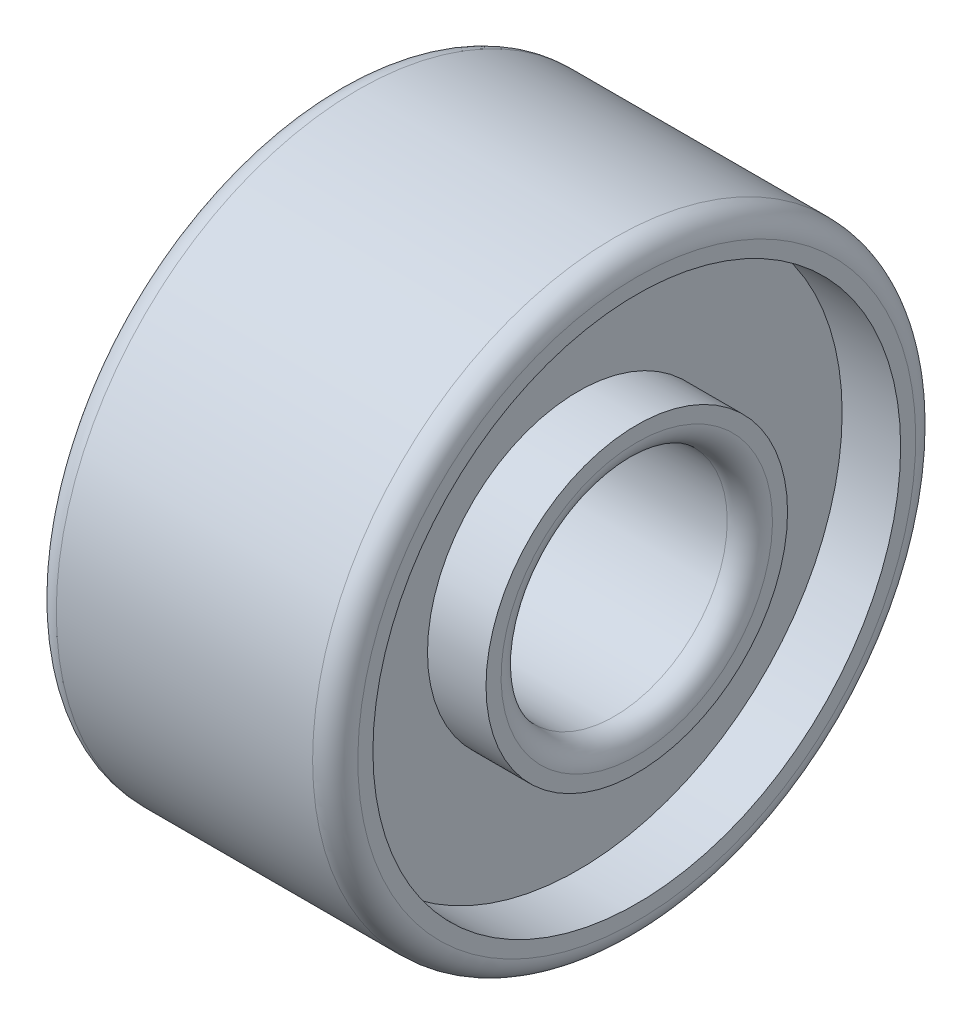
ISO-10303-21;
HEADER;
FILE_DESCRIPTION(('STEP AP214'),'2;1');
FILE_NAME('part.step','',(''),(''),'','','');
FILE_SCHEMA(('AUTOMOTIVE_DESIGN { 1 0 10303 214 1 1 1 1 }'));
ENDSEC;
DATA;
#1=APPLICATION_CONTEXT('core data for automotive mechanical design processes');
#2=APPLICATION_PROTOCOL_DEFINITION('international standard','automotive_design',2000,#1);
#3=PRODUCT_CONTEXT('',#1,'mechanical');
#4=PRODUCT('Part','Part','',(#3));
#5=PRODUCT_RELATED_PRODUCT_CATEGORY('part','',(#4));
#6=PRODUCT_DEFINITION_FORMATION('','',#4);
#7=PRODUCT_DEFINITION_CONTEXT('part definition',#1,'design');
#8=PRODUCT_DEFINITION('design','',#6,#7);
#9=PRODUCT_DEFINITION_SHAPE('','',#8);
#10=(LENGTH_UNIT() NAMED_UNIT(*) SI_UNIT(.MILLI.,.METRE.));
#11=(NAMED_UNIT(*) PLANE_ANGLE_UNIT() SI_UNIT($,.RADIAN.));
#12=(NAMED_UNIT(*) SI_UNIT($,.STERADIAN.) SOLID_ANGLE_UNIT());
#13=UNCERTAINTY_MEASURE_WITH_UNIT(LENGTH_MEASURE(1.E-05),#10,'distance_accuracy_value','');
#14=(GEOMETRIC_REPRESENTATION_CONTEXT(3) GLOBAL_UNCERTAINTY_ASSIGNED_CONTEXT((#13)) GLOBAL_UNIT_ASSIGNED_CONTEXT((#10,
#11,#12)) REPRESENTATION_CONTEXT('',''));
#15=CARTESIAN_POINT('',(0.,0.,0.));
#16=DIRECTION('',(0.,0.,1.));
#17=DIRECTION('',(1.,0.,0.));
#18=AXIS2_PLACEMENT_3D('',#15,#16,#17);
#19=CARTESIAN_POINT('',(0.,1.94454364826301,1.94454364826301));
#20=DIRECTION('',(1.,0.,0.));
#21=DIRECTION('',(0.,-0.707106781186548,0.707106781186548));
#22=AXIS2_PLACEMENT_3D('',#19,#20,#21);
#23=SPHERICAL_SURFACE('',#22,0.75);
#24=CARTESIAN_POINT('',(-0.749999999999993,1.94454364826301,1.94454364826301));
#25=VERTEX_POINT('',#24);
#26=VERTEX_LOOP('',#25);
#27=FACE_BOUND('',#26,.T.);
#28=CARTESIAN_POINT('',(0.750000000000007,1.94454364826301,1.94454364826301));
#29=VERTEX_POINT('',#28);
#30=VERTEX_LOOP('',#29);
#31=FACE_BOUND('',#30,.T.);
#32=ADVANCED_FACE('P0_F15',(#27,#31),#23,.T.);
#33=CLOSED_SHELL('',(#32));
#34=MANIFOLD_SOLID_BREP('P0_B1',#33);
#35=CARTESIAN_POINT('',(0.,0.,2.75));
#36=DIRECTION('',(1.,0.,0.));
#37=DIRECTION('',(0.,-1.,0.));
#38=AXIS2_PLACEMENT_3D('',#35,#36,#37);
#39=SPHERICAL_SURFACE('',#38,0.75);
#40=CARTESIAN_POINT('',(-0.749999999999993,0.,2.75));
#41=VERTEX_POINT('',#40);
#42=VERTEX_LOOP('',#41);
#43=FACE_BOUND('',#42,.T.);
#44=CARTESIAN_POINT('',(0.750000000000007,0.,2.75));
#45=VERTEX_POINT('',#44);
#46=VERTEX_LOOP('',#45);
#47=FACE_BOUND('',#46,.T.);
#48=ADVANCED_FACE('P1_F16',(#43,#47),#39,.T.);
#49=CLOSED_SHELL('',(#48));
#50=MANIFOLD_SOLID_BREP('P1_B1',#49);
#51=CARTESIAN_POINT('',(0.,-1.94454364826301,1.94454364826301));
#52=DIRECTION('',(1.,0.,0.));
#53=DIRECTION('',(0.,-0.707106781186548,-0.707106781186548));
#54=AXIS2_PLACEMENT_3D('',#51,#52,#53);
#55=SPHERICAL_SURFACE('',#54,0.75);
#56=CARTESIAN_POINT('',(-0.749999999999993,-1.94454364826301,1.94454364826301));
#57=VERTEX_POINT('',#56);
#58=VERTEX_LOOP('',#57);
#59=FACE_BOUND('',#58,.T.);
#60=CARTESIAN_POINT('',(0.750000000000007,-1.94454364826301,1.94454364826301));
#61=VERTEX_POINT('',#60);
#62=VERTEX_LOOP('',#61);
#63=FACE_BOUND('',#62,.T.);
#64=ADVANCED_FACE('P2_F16',(#59,#63),#55,.T.);
#65=CLOSED_SHELL('',(#64));
#66=MANIFOLD_SOLID_BREP('P2_B1',#65);
#67=CARTESIAN_POINT('',(0.,-2.75,0.));
#68=DIRECTION('',(1.,0.,0.));
#69=DIRECTION('',(0.,0.,-1.));
#70=AXIS2_PLACEMENT_3D('',#67,#68,#69);
#71=SPHERICAL_SURFACE('',#70,0.75);
#72=CARTESIAN_POINT('',(-0.749999999999993,-2.75,0.));
#73=VERTEX_POINT('',#72);
#74=VERTEX_LOOP('',#73);
#75=FACE_BOUND('',#74,.T.);
#76=CARTESIAN_POINT('',(0.750000000000007,-2.75,0.));
#77=VERTEX_POINT('',#76);
#78=VERTEX_LOOP('',#77);
#79=FACE_BOUND('',#78,.T.);
#80=ADVANCED_FACE('P3_F16',(#75,#79),#71,.T.);
#81=CLOSED_SHELL('',(#80));
#82=MANIFOLD_SOLID_BREP('P3_B1',#81);
#83=CARTESIAN_POINT('',(0.,-1.94454364826301,-1.94454364826301));
#84=DIRECTION('',(1.,0.,0.));
#85=DIRECTION('',(0.,0.707106781186548,-0.707106781186548));
#86=AXIS2_PLACEMENT_3D('',#83,#84,#85);
#87=SPHERICAL_SURFACE('',#86,0.75);
#88=CARTESIAN_POINT('',(-0.749999999999993,-1.94454364826301,-1.94454364826301));
#89=VERTEX_POINT('',#88);
#90=VERTEX_LOOP('',#89);
#91=FACE_BOUND('',#90,.T.);
#92=CARTESIAN_POINT('',(0.750000000000007,-1.94454364826301,-1.94454364826301));
#93=VERTEX_POINT('',#92);
#94=VERTEX_LOOP('',#93);
#95=FACE_BOUND('',#94,.T.);
#96=ADVANCED_FACE('P4_F16',(#91,#95),#87,.T.);
#97=CLOSED_SHELL('',(#96));
#98=MANIFOLD_SOLID_BREP('P4_B1',#97);
#99=CARTESIAN_POINT('',(0.,0.,-2.75));
#100=DIRECTION('',(1.,0.,0.));
#101=DIRECTION('',(0.,1.,0.));
#102=AXIS2_PLACEMENT_3D('',#99,#100,#101);
#103=SPHERICAL_SURFACE('',#102,0.75);
#104=CARTESIAN_POINT('',(-0.749999999999993,0.,-2.75));
#105=VERTEX_POINT('',#104);
#106=VERTEX_LOOP('',#105);
#107=FACE_BOUND('',#106,.T.);
#108=CARTESIAN_POINT('',(0.750000000000007,0.,-2.75));
#109=VERTEX_POINT('',#108);
#110=VERTEX_LOOP('',#109);
#111=FACE_BOUND('',#110,.T.);
#112=ADVANCED_FACE('P5_F16',(#107,#111),#103,.T.);
#113=CLOSED_SHELL('',(#112));
#114=MANIFOLD_SOLID_BREP('P5_B1',#113);
#115=CARTESIAN_POINT('',(0.,1.94454364826301,-1.94454364826301));
#116=DIRECTION('',(1.,0.,0.));
#117=DIRECTION('',(0.,0.707106781186548,0.707106781186548));
#118=AXIS2_PLACEMENT_3D('',#115,#116,#117);
#119=SPHERICAL_SURFACE('',#118,0.75);
#120=CARTESIAN_POINT('',(-0.749999999999993,1.94454364826301,-1.94454364826301));
#121=VERTEX_POINT('',#120);
#122=VERTEX_LOOP('',#121);
#123=FACE_BOUND('',#122,.T.);
#124=CARTESIAN_POINT('',(0.750000000000007,1.94454364826301,-1.94454364826301));
#125=VERTEX_POINT('',#124);
#126=VERTEX_LOOP('',#125);
#127=FACE_BOUND('',#126,.T.);
#128=ADVANCED_FACE('P6_F16',(#123,#127),#119,.T.);
#129=CLOSED_SHELL('',(#128));
#130=MANIFOLD_SOLID_BREP('P6_B1',#129);
#131=CARTESIAN_POINT('',(-1.07407407407407,0.,0.));
#132=DIRECTION('',(1.,0.,0.));
#133=DIRECTION('',(0.,0.,-1.));
#134=AXIS2_PLACEMENT_3D('',#131,#132,#133);
#135=PLANE('',#134);
#136=CARTESIAN_POINT('',(-1.07407407407407,0.,0.));
#137=DIRECTION('',(-1.,0.,0.));
#138=DIRECTION('',(0.,0.,1.));
#139=AXIS2_PLACEMENT_3D('',#136,#137,#138);
#140=CIRCLE('',#139,2.);
#141=CARTESIAN_POINT('',(-1.07407407407407,0.,2.));
#142=VERTEX_POINT('',#141);
#143=EDGE_CURVE('P7_E27',#142,#142,#140,.T.);
#144=ORIENTED_EDGE('',*,*,#143,.T.);
#145=EDGE_LOOP('',(#144));
#146=FACE_BOUND('',#145,.T.);
#147=CARTESIAN_POINT('',(-1.07407407407407,0.,0.));
#148=DIRECTION('',(-1.,0.,0.));
#149=DIRECTION('',(0.,0.,1.));
#150=AXIS2_PLACEMENT_3D('',#147,#148,#149);
#151=CIRCLE('',#150,3.65);
#152=CARTESIAN_POINT('',(-1.07407407407407,0.,3.65));
#153=VERTEX_POINT('',#152);
#154=EDGE_CURVE('P7_E18',#153,#153,#151,.T.);
#155=ORIENTED_EDGE('',*,*,#154,.F.);
#156=EDGE_LOOP('',(#155));
#157=FACE_BOUND('',#156,.T.);
#158=ADVANCED_FACE('P7_F15',(#146,#157),#135,.T.);
#159=CARTESIAN_POINT('',(-1.07407407407407,0.,0.));
#160=DIRECTION('',(-1.,0.,0.));
#161=DIRECTION('',(0.,0.,1.));
#162=AXIS2_PLACEMENT_3D('',#159,#160,#161);
#163=CYLINDRICAL_SURFACE('',#162,3.65);
#164=ORIENTED_EDGE('',*,*,#154,.T.);
#165=EDGE_LOOP('',(#164));
#166=FACE_BOUND('',#165,.T.);
#167=CARTESIAN_POINT('',(-1.22407407407408,0.,0.));
#168=DIRECTION('',(-1.,0.,0.));
#169=DIRECTION('',(0.,0.,1.));
#170=AXIS2_PLACEMENT_3D('',#167,#168,#169);
#171=CIRCLE('',#170,3.65);
#172=CARTESIAN_POINT('',(-1.22407407407408,0.,3.65));
#173=VERTEX_POINT('',#172);
#174=EDGE_CURVE('P7_E22',#173,#173,#171,.T.);
#175=ORIENTED_EDGE('',*,*,#174,.F.);
#176=EDGE_LOOP('',(#175));
#177=FACE_BOUND('',#176,.T.);
#178=ADVANCED_FACE('P7_F35',(#166,#177),#163,.T.);
#179=CARTESIAN_POINT('',(-1.22407407407408,0.,0.));
#180=DIRECTION('',(-1.,0.,0.));
#181=DIRECTION('',(0.,0.,1.));
#182=AXIS2_PLACEMENT_3D('',#179,#180,#181);
#183=CYLINDRICAL_SURFACE('',#182,2.);
#184=ORIENTED_EDGE('',*,*,#143,.F.);
#185=EDGE_LOOP('',(#184));
#186=FACE_BOUND('',#185,.T.);
#187=CARTESIAN_POINT('',(-1.22407407407408,0.,0.));
#188=DIRECTION('',(-1.,0.,0.));
#189=DIRECTION('',(0.,0.,1.));
#190=AXIS2_PLACEMENT_3D('',#187,#188,#189);
#191=CIRCLE('',#190,2.);
#192=CARTESIAN_POINT('',(-1.22407407407408,0.,2.));
#193=VERTEX_POINT('',#192);
#194=EDGE_CURVE('P7_E10',#193,#193,#191,.F.);
#195=ORIENTED_EDGE('',*,*,#194,.F.);
#196=EDGE_LOOP('',(#195));
#197=FACE_BOUND('',#196,.T.);
#198=ADVANCED_FACE('P7_F43',(#186,#197),#183,.F.);
#199=CARTESIAN_POINT('',(-1.22407407407408,0.,0.));
#200=DIRECTION('',(-1.,0.,0.));
#201=DIRECTION('',(0.,0.,1.));
#202=AXIS2_PLACEMENT_3D('',#199,#200,#201);
#203=PLANE('',#202);
#204=ORIENTED_EDGE('',*,*,#194,.T.);
#205=EDGE_LOOP('',(#204));
#206=FACE_BOUND('',#205,.T.);
#207=ORIENTED_EDGE('',*,*,#174,.T.);
#208=EDGE_LOOP('',(#207));
#209=FACE_BOUND('',#208,.T.);
#210=ADVANCED_FACE('P7_F44',(#206,#209),#203,.T.);
#211=CLOSED_SHELL('',(#158,#178,#198,#210));
#212=MANIFOLD_SOLID_BREP('P7_B1',#211);
#213=CARTESIAN_POINT('',(1.07407407407407,0.,0.));
#214=DIRECTION('',(-1.,0.,0.));
#215=DIRECTION('',(0.,0.,1.));
#216=AXIS2_PLACEMENT_3D('',#213,#214,#215);
#217=PLANE('',#216);
#218=CARTESIAN_POINT('',(1.07407407407407,0.,0.));
#219=DIRECTION('',(1.,0.,0.));
#220=DIRECTION('',(0.,0.,-1.));
#221=AXIS2_PLACEMENT_3D('',#218,#219,#220);
#222=CIRCLE('',#221,2.);
#223=CARTESIAN_POINT('',(1.07407407407407,0.,-2.));
#224=VERTEX_POINT('',#223);
#225=EDGE_CURVE('P8_E27',#224,#224,#222,.T.);
#226=ORIENTED_EDGE('',*,*,#225,.T.);
#227=EDGE_LOOP('',(#226));
#228=FACE_BOUND('',#227,.T.);
#229=CARTESIAN_POINT('',(1.07407407407407,0.,0.));
#230=DIRECTION('',(1.,0.,0.));
#231=DIRECTION('',(0.,0.,-1.));
#232=AXIS2_PLACEMENT_3D('',#229,#230,#231);
#233=CIRCLE('',#232,3.65);
#234=CARTESIAN_POINT('',(1.07407407407407,0.,-3.65));
#235=VERTEX_POINT('',#234);
#236=EDGE_CURVE('P8_E18',#235,#235,#233,.T.);
#237=ORIENTED_EDGE('',*,*,#236,.F.);
#238=EDGE_LOOP('',(#237));
#239=FACE_BOUND('',#238,.T.);
#240=ADVANCED_FACE('P8_F15',(#228,#239),#217,.T.);
#241=CARTESIAN_POINT('',(1.07407407407407,0.,0.));
#242=DIRECTION('',(1.,0.,0.));
#243=DIRECTION('',(0.,0.,-1.));
#244=AXIS2_PLACEMENT_3D('',#241,#242,#243);
#245=CYLINDRICAL_SURFACE('',#244,3.65);
#246=ORIENTED_EDGE('',*,*,#236,.T.);
#247=EDGE_LOOP('',(#246));
#248=FACE_BOUND('',#247,.T.);
#249=CARTESIAN_POINT('',(1.22407407407408,0.,0.));
#250=DIRECTION('',(1.,0.,0.));
#251=DIRECTION('',(0.,0.,-1.));
#252=AXIS2_PLACEMENT_3D('',#249,#250,#251);
#253=CIRCLE('',#252,3.65);
#254=CARTESIAN_POINT('',(1.22407407407408,0.,-3.65));
#255=VERTEX_POINT('',#254);
#256=EDGE_CURVE('P8_E22',#255,#255,#253,.T.);
#257=ORIENTED_EDGE('',*,*,#256,.F.);
#258=EDGE_LOOP('',(#257));
#259=FACE_BOUND('',#258,.T.);
#260=ADVANCED_FACE('P8_F35',(#248,#259),#245,.T.);
#261=CARTESIAN_POINT('',(1.22407407407408,0.,0.));
#262=DIRECTION('',(1.,0.,0.));
#263=DIRECTION('',(0.,0.,-1.));
#264=AXIS2_PLACEMENT_3D('',#261,#262,#263);
#265=CYLINDRICAL_SURFACE('',#264,2.);
#266=ORIENTED_EDGE('',*,*,#225,.F.);
#267=EDGE_LOOP('',(#266));
#268=FACE_BOUND('',#267,.T.);
#269=CARTESIAN_POINT('',(1.22407407407408,0.,0.));
#270=DIRECTION('',(1.,0.,0.));
#271=DIRECTION('',(0.,0.,-1.));
#272=AXIS2_PLACEMENT_3D('',#269,#270,#271);
#273=CIRCLE('',#272,2.);
#274=CARTESIAN_POINT('',(1.22407407407408,0.,-2.));
#275=VERTEX_POINT('',#274);
#276=EDGE_CURVE('P8_E10',#275,#275,#273,.F.);
#277=ORIENTED_EDGE('',*,*,#276,.F.);
#278=EDGE_LOOP('',(#277));
#279=FACE_BOUND('',#278,.T.);
#280=ADVANCED_FACE('P8_F43',(#268,#279),#265,.F.);
#281=CARTESIAN_POINT('',(1.22407407407408,0.,0.));
#282=DIRECTION('',(1.,0.,0.));
#283=DIRECTION('',(0.,0.,-1.));
#284=AXIS2_PLACEMENT_3D('',#281,#282,#283);
#285=PLANE('',#284);
#286=ORIENTED_EDGE('',*,*,#276,.T.);
#287=EDGE_LOOP('',(#286));
#288=FACE_BOUND('',#287,.T.);
#289=ORIENTED_EDGE('',*,*,#256,.T.);
#290=EDGE_LOOP('',(#289));
#291=FACE_BOUND('',#290,.T.);
#292=ADVANCED_FACE('P8_F44',(#288,#291),#285,.T.);
#293=CLOSED_SHELL('',(#240,#260,#280,#292));
#294=MANIFOLD_SOLID_BREP('P8_B1',#293);
#295=CARTESIAN_POINT('',(0.,2.75,0.));
#296=DIRECTION('',(1.,0.,0.));
#297=DIRECTION('',(0.,0.,1.));
#298=AXIS2_PLACEMENT_3D('',#295,#296,#297);
#299=SPHERICAL_SURFACE('',#298,0.75);
#300=CARTESIAN_POINT('',(-0.749999999999993,2.75,0.));
#301=VERTEX_POINT('',#300);
#302=VERTEX_LOOP('',#301);
#303=FACE_BOUND('',#302,.T.);
#304=CARTESIAN_POINT('',(0.750000000000007,2.75,0.));
#305=VERTEX_POINT('',#304);
#306=VERTEX_LOOP('',#305);
#307=FACE_BOUND('',#306,.T.);
#308=ADVANCED_FACE('P9_F16',(#303,#307),#299,.T.);
#309=CLOSED_SHELL('',(#308));
#310=MANIFOLD_SOLID_BREP('P9_B1',#309);
#311=CARTESIAN_POINT('',(0.,0.,0.));
#312=DIRECTION('',(1.,0.,0.));
#313=DIRECTION('',(0.,1.,0.));
#314=AXIS2_PLACEMENT_3D('',#311,#312,#313);
#315=TOROIDAL_SURFACE('',#314,2.75,0.75);
#316=CARTESIAN_POINT('',(-0.481534007106452,0.,0.));
#317=DIRECTION('',(1.,0.,0.));
#318=DIRECTION('',(0.,0.,-1.));
#319=AXIS2_PLACEMENT_3D('',#316,#317,#318);
#320=CIRCLE('',#319,3.325);
#321=CARTESIAN_POINT('',(-0.481534007106452,0.,-3.325));
#322=VERTEX_POINT('',#321);
#323=EDGE_CURVE('P10_E169',#322,#322,#320,.F.);
#324=ORIENTED_EDGE('',*,*,#323,.T.);
#325=EDGE_LOOP('',(#324));
#326=FACE_BOUND('',#325,.T.);
#327=CARTESIAN_POINT('',(0.481534007106451,0.,0.));
#328=DIRECTION('',(1.,0.,0.));
#329=DIRECTION('',(0.,0.,-1.));
#330=AXIS2_PLACEMENT_3D('',#327,#328,#329);
#331=CIRCLE('',#330,3.325);
#332=CARTESIAN_POINT('',(0.481534007106451,0.,-3.325));
#333=VERTEX_POINT('',#332);
#334=EDGE_CURVE('P10_E172',#333,#333,#331,.T.);
#335=ORIENTED_EDGE('',*,*,#334,.T.);
#336=EDGE_LOOP('',(#335));
#337=FACE_BOUND('',#336,.T.);
#338=ADVANCED_FACE('P10_F15',(#326,#337),#315,.F.);
#339=CARTESIAN_POINT('',(2.00000000000003,0.,0.));
#340=DIRECTION('',(1.,0.,0.));
#341=DIRECTION('',(0.,0.,-1.));
#342=AXIS2_PLACEMENT_3D('',#339,#340,#341);
#343=CYLINDRICAL_SURFACE('',#342,3.325);
#344=ORIENTED_EDGE('',*,*,#334,.F.);
#345=EDGE_LOOP('',(#344));
#346=FACE_BOUND('',#345,.T.);
#347=CARTESIAN_POINT('',(1.07407407407408,0.,0.));
#348=DIRECTION('',(1.,0.,0.));
#349=DIRECTION('',(0.,0.,-1.));
#350=AXIS2_PLACEMENT_3D('',#347,#348,#349);
#351=CIRCLE('',#350,3.325);
#352=CARTESIAN_POINT('',(1.07407407407408,0.,-3.325));
#353=VERTEX_POINT('',#352);
#354=EDGE_CURVE('P10_E19',#353,#353,#351,.T.);
#355=ORIENTED_EDGE('',*,*,#354,.T.);
#356=EDGE_LOOP('',(#355));
#357=FACE_BOUND('',#356,.T.);
#358=ADVANCED_FACE('P10_F118',(#346,#357),#343,.F.);
#359=CARTESIAN_POINT('',(2.00000000000003,0.,0.));
#360=DIRECTION('',(1.,0.,0.));
#361=DIRECTION('',(0.,0.,-1.));
#362=AXIS2_PLACEMENT_3D('',#359,#360,#361);
#363=CYLINDRICAL_SURFACE('',#362,3.325);
#364=CARTESIAN_POINT('',(-1.07407407407407,0.,0.));
#365=DIRECTION('',(1.,0.,0.));
#366=DIRECTION('',(0.,0.,-1.));
#367=AXIS2_PLACEMENT_3D('',#364,#365,#366);
#368=CIRCLE('',#367,3.325);
#369=CARTESIAN_POINT('',(-1.07407407407407,0.,-3.325));
#370=VERTEX_POINT('',#369);
#371=EDGE_CURVE('P10_E165',#370,#370,#368,.F.);
#372=ORIENTED_EDGE('',*,*,#371,.T.);
#373=EDGE_LOOP('',(#372));
#374=FACE_BOUND('',#373,.T.);
#375=ORIENTED_EDGE('',*,*,#323,.F.);
#376=EDGE_LOOP('',(#375));
#377=FACE_BOUND('',#376,.T.);
#378=ADVANCED_FACE('P10_F115',(#374,#377),#363,.F.);
#379=CARTESIAN_POINT('',(1.07407407407408,0.,0.));
#380=DIRECTION('',(-1.,0.,0.));
#381=DIRECTION('',(0.,0.,1.));
#382=AXIS2_PLACEMENT_3D('',#379,#380,#381);
#383=PLANE('',#382);
#384=ORIENTED_EDGE('',*,*,#354,.F.);
#385=EDGE_LOOP('',(#384));
#386=FACE_BOUND('',#385,.T.);
#387=CARTESIAN_POINT('',(1.07407407407408,0.,0.));
#388=DIRECTION('',(1.,0.,0.));
#389=DIRECTION('',(0.,0.,-1.));
#390=AXIS2_PLACEMENT_3D('',#387,#388,#389);
#391=CIRCLE('',#390,3.64999999999999);
#392=CARTESIAN_POINT('',(1.07407407407408,0.,-3.64999999999999));
#393=VERTEX_POINT('',#392);
#394=EDGE_CURVE('P10_E163',#393,#393,#391,.T.);
#395=ORIENTED_EDGE('',*,*,#394,.T.);
#396=EDGE_LOOP('',(#395));
#397=FACE_BOUND('',#396,.T.);
#398=ADVANCED_FACE('P10_F111',(#386,#397),#383,.F.);
#399=CARTESIAN_POINT('',(-1.07407407407407,0.,0.));
#400=DIRECTION('',(1.,0.,0.));
#401=DIRECTION('',(0.,0.,-1.));
#402=AXIS2_PLACEMENT_3D('',#399,#400,#401);
#403=PLANE('',#402);
#404=ORIENTED_EDGE('',*,*,#371,.F.);
#405=EDGE_LOOP('',(#404));
#406=FACE_BOUND('',#405,.T.);
#407=CARTESIAN_POINT('',(-1.07407407407406,0.,0.));
#408=DIRECTION('',(1.,0.,0.));
#409=DIRECTION('',(0.,0.,-1.));
#410=AXIS2_PLACEMENT_3D('',#407,#408,#409);
#411=CIRCLE('',#410,3.64999999999998);
#412=CARTESIAN_POINT('',(-1.07407407407406,0.,-3.64999999999998));
#413=VERTEX_POINT('',#412);
#414=EDGE_CURVE('P10_E160',#413,#413,#411,.F.);
#415=ORIENTED_EDGE('',*,*,#414,.T.);
#416=EDGE_LOOP('',(#415));
#417=FACE_BOUND('',#416,.T.);
#418=ADVANCED_FACE('P10_F107',(#406,#417),#403,.F.);
#419=CARTESIAN_POINT('',(1.07407407407408,0.,0.));
#420=DIRECTION('',(1.,0.,0.));
#421=DIRECTION('',(0.,0.,-1.));
#422=AXIS2_PLACEMENT_3D('',#419,#420,#421);
#423=CYLINDRICAL_SURFACE('',#422,3.64999999999999);
#424=ORIENTED_EDGE('',*,*,#394,.F.);
#425=EDGE_LOOP('',(#424));
#426=FACE_BOUND('',#425,.T.);
#427=CARTESIAN_POINT('',(1.22407407407407,0.,0.));
#428=DIRECTION('',(1.,0.,0.));
#429=DIRECTION('',(0.,0.,-1.));
#430=AXIS2_PLACEMENT_3D('',#427,#428,#429);
#431=CIRCLE('',#430,3.64999999999999);
#432=CARTESIAN_POINT('',(1.22407407407407,0.,-3.64999999999999));
#433=VERTEX_POINT('',#432);
#434=EDGE_CURVE('P10_E157',#433,#433,#431,.T.);
#435=ORIENTED_EDGE('',*,*,#434,.T.);
#436=EDGE_LOOP('',(#435));
#437=FACE_BOUND('',#436,.T.);
#438=ADVANCED_FACE('P10_F103',(#426,#437),#423,.F.);
#439=CARTESIAN_POINT('',(-1.22407407407407,0.,0.));
#440=DIRECTION('',(1.,0.,0.));
#441=DIRECTION('',(0.,0.,-1.));
#442=AXIS2_PLACEMENT_3D('',#439,#440,#441);
#443=CYLINDRICAL_SURFACE('',#442,3.64999999999998);
#444=CARTESIAN_POINT('',(-1.22407407407407,0.,0.));
#445=DIRECTION('',(1.,0.,0.));
#446=DIRECTION('',(0.,0.,-1.));
#447=AXIS2_PLACEMENT_3D('',#444,#445,#446);
#448=CIRCLE('',#447,3.64999999999998);
#449=CARTESIAN_POINT('',(-1.22407407407407,0.,-3.64999999999998));
#450=VERTEX_POINT('',#449);
#451=EDGE_CURVE('P10_E154',#450,#450,#448,.F.);
#452=ORIENTED_EDGE('',*,*,#451,.T.);
#453=EDGE_LOOP('',(#452));
#454=FACE_BOUND('',#453,.T.);
#455=ORIENTED_EDGE('',*,*,#414,.F.);
#456=EDGE_LOOP('',(#455));
#457=FACE_BOUND('',#456,.T.);
#458=ADVANCED_FACE('P10_F99',(#454,#457),#443,.F.);
#459=CARTESIAN_POINT('',(1.22407407407407,0.,0.));
#460=DIRECTION('',(1.,0.,0.));
#461=DIRECTION('',(0.,0.,-1.));
#462=AXIS2_PLACEMENT_3D('',#459,#460,#461);
#463=PLANE('',#462);
#464=CARTESIAN_POINT('',(1.22407407407407,0.,0.));
#465=DIRECTION('',(1.,0.,0.));
#466=DIRECTION('',(0.,0.,-1.));
#467=AXIS2_PLACEMENT_3D('',#464,#465,#466);
#468=CIRCLE('',#467,3.49999999999999);
#469=CARTESIAN_POINT('',(1.22407407407407,0.,-3.49999999999999));
#470=VERTEX_POINT('',#469);
#471=EDGE_CURVE('P10_E151',#470,#470,#468,.T.);
#472=ORIENTED_EDGE('',*,*,#471,.T.);
#473=EDGE_LOOP('',(#472));
#474=FACE_BOUND('',#473,.T.);
#475=ORIENTED_EDGE('',*,*,#434,.F.);
#476=EDGE_LOOP('',(#475));
#477=FACE_BOUND('',#476,.T.);
#478=ADVANCED_FACE('P10_F95',(#474,#477),#463,.F.);
#479=CARTESIAN_POINT('',(-1.22407407407407,0.,0.));
#480=DIRECTION('',(-1.,0.,0.));
#481=DIRECTION('',(0.,0.,1.));
#482=AXIS2_PLACEMENT_3D('',#479,#480,#481);
#483=PLANE('',#482);
#484=CARTESIAN_POINT('',(-1.22407407407407,0.,0.));
#485=DIRECTION('',(1.,0.,0.));
#486=DIRECTION('',(0.,0.,-1.));
#487=AXIS2_PLACEMENT_3D('',#484,#485,#486);
#488=CIRCLE('',#487,3.5);
#489=CARTESIAN_POINT('',(-1.22407407407407,0.,-3.5));
#490=VERTEX_POINT('',#489);
#491=EDGE_CURVE('P10_E144',#490,#490,#488,.F.);
#492=ORIENTED_EDGE('',*,*,#491,.T.);
#493=EDGE_LOOP('',(#492));
#494=FACE_BOUND('',#493,.T.);
#495=ORIENTED_EDGE('',*,*,#451,.F.);
#496=EDGE_LOOP('',(#495));
#497=FACE_BOUND('',#496,.T.);
#498=ADVANCED_FACE('P10_F91',(#494,#497),#483,.F.);
#499=CARTESIAN_POINT('',(1.22407407407407,0.,0.));
#500=DIRECTION('',(1.,0.,0.));
#501=DIRECTION('',(0.,0.,-1.));
#502=AXIS2_PLACEMENT_3D('',#499,#500,#501);
#503=CYLINDRICAL_SURFACE('',#502,3.49999999999999);
#504=ORIENTED_EDGE('',*,*,#471,.F.);
#505=EDGE_LOOP('',(#504));
#506=FACE_BOUND('',#505,.T.);
#507=CARTESIAN_POINT('',(2.,0.,0.));
#508=DIRECTION('',(1.,0.,0.));
#509=DIRECTION('',(0.,0.,-1.));
#510=AXIS2_PLACEMENT_3D('',#507,#508,#509);
#511=CIRCLE('',#510,3.49999999999999);
#512=CARTESIAN_POINT('',(2.,0.,-3.49999999999999));
#513=VERTEX_POINT('',#512);
#514=EDGE_CURVE('P10_E139',#513,#513,#511,.F.);
#515=ORIENTED_EDGE('',*,*,#514,.F.);
#516=EDGE_LOOP('',(#515));
#517=FACE_BOUND('',#516,.T.);
#518=ADVANCED_FACE('P10_F87',(#506,#517),#503,.F.);
#519=CARTESIAN_POINT('',(-2.,0.,0.));
#520=DIRECTION('',(1.,0.,0.));
#521=DIRECTION('',(0.,0.,-1.));
#522=AXIS2_PLACEMENT_3D('',#519,#520,#521);
#523=CYLINDRICAL_SURFACE('',#522,3.5);
#524=CARTESIAN_POINT('',(-2.,0.,0.));
#525=DIRECTION('',(1.,0.,0.));
#526=DIRECTION('',(0.,0.,-1.));
#527=AXIS2_PLACEMENT_3D('',#524,#525,#526);
#528=CIRCLE('',#527,3.5);
#529=CARTESIAN_POINT('',(-2.,0.,-3.5));
#530=VERTEX_POINT('',#529);
#531=EDGE_CURVE('P10_E137',#530,#530,#528,.T.);
#532=ORIENTED_EDGE('',*,*,#531,.F.);
#533=EDGE_LOOP('',(#532));
#534=FACE_BOUND('',#533,.T.);
#535=ORIENTED_EDGE('',*,*,#491,.F.);
#536=EDGE_LOOP('',(#535));
#537=FACE_BOUND('',#536,.T.);
#538=ADVANCED_FACE('P10_F82',(#534,#537),#523,.F.);
#539=CARTESIAN_POINT('',(2.00000000000003,0.,0.));
#540=DIRECTION('',(1.,0.,0.));
#541=DIRECTION('',(0.,0.,-1.));
#542=AXIS2_PLACEMENT_3D('',#539,#540,#541);
#543=PLANE('',#542);
#544=ORIENTED_EDGE('',*,*,#514,.T.);
#545=EDGE_LOOP('',(#544));
#546=FACE_BOUND('',#545,.T.);
#547=CARTESIAN_POINT('',(2.00000000000003,0.,0.));
#548=DIRECTION('',(-1.,0.,0.));
#549=DIRECTION('',(0.,1.,0.));
#550=AXIS2_PLACEMENT_3D('',#547,#548,#549);
#551=CIRCLE('',#550,3.7);
#552=CARTESIAN_POINT('',(2.00000000000003,3.7,0.));
#553=VERTEX_POINT('',#552);
#554=EDGE_CURVE('P10_E66',#553,#553,#551,.T.);
#555=ORIENTED_EDGE('',*,*,#554,.F.);
#556=EDGE_LOOP('',(#555));
#557=FACE_BOUND('',#556,.T.);
#558=ADVANCED_FACE('P10_F72',(#546,#557),#543,.T.);
#559=CARTESIAN_POINT('',(-1.99999999999999,0.,0.));
#560=DIRECTION('',(-1.,0.,0.));
#561=DIRECTION('',(0.,0.,1.));
#562=AXIS2_PLACEMENT_3D('',#559,#560,#561);
#563=PLANE('',#562);
#564=ORIENTED_EDGE('',*,*,#531,.T.);
#565=EDGE_LOOP('',(#564));
#566=FACE_BOUND('',#565,.T.);
#567=CARTESIAN_POINT('',(-1.99999999999999,0.,0.));
#568=DIRECTION('',(1.,0.,0.));
#569=DIRECTION('',(0.,1.,0.));
#570=AXIS2_PLACEMENT_3D('',#567,#568,#569);
#571=CIRCLE('',#570,3.7);
#572=CARTESIAN_POINT('',(-1.99999999999999,3.7,0.));
#573=VERTEX_POINT('',#572);
#574=EDGE_CURVE('P10_E28',#573,#573,#571,.T.);
#575=ORIENTED_EDGE('',*,*,#574,.F.);
#576=EDGE_LOOP('',(#575));
#577=FACE_BOUND('',#576,.T.);
#578=ADVANCED_FACE('P10_F81',(#566,#577),#563,.T.);
#579=CARTESIAN_POINT('',(1.70000000000003,0.,0.));
#580=DIRECTION('',(1.,0.,0.));
#581=DIRECTION('',(0.,1.,0.));
#582=AXIS2_PLACEMENT_3D('',#579,#580,#581);
#583=TOROIDAL_SURFACE('',#582,3.7,0.3);
#584=CARTESIAN_POINT('',(1.70000000000003,0.,0.));
#585=DIRECTION('',(1.,0.,0.));
#586=DIRECTION('',(0.,0.,-1.));
#587=AXIS2_PLACEMENT_3D('',#584,#585,#586);
#588=CIRCLE('',#587,4.);
#589=CARTESIAN_POINT('',(1.70000000000003,0.,-4.));
#590=VERTEX_POINT('',#589);
#591=EDGE_CURVE('P10_E23',#590,#590,#588,.F.);
#592=ORIENTED_EDGE('',*,*,#591,.F.);
#593=EDGE_LOOP('',(#592));
#594=FACE_BOUND('',#593,.T.);
#595=ORIENTED_EDGE('',*,*,#554,.T.);
#596=EDGE_LOOP('',(#595));
#597=FACE_BOUND('',#596,.T.);
#598=ADVANCED_FACE('P10_F46',(#594,#597),#583,.T.);
#599=CARTESIAN_POINT('',(-1.69999999999999,0.,0.));
#600=DIRECTION('',(1.,0.,0.));
#601=DIRECTION('',(0.,1.,0.));
#602=AXIS2_PLACEMENT_3D('',#599,#600,#601);
#603=TOROIDAL_SURFACE('',#602,3.7,0.3);
#604=ORIENTED_EDGE('',*,*,#574,.T.);
#605=EDGE_LOOP('',(#604));
#606=FACE_BOUND('',#605,.T.);
#607=CARTESIAN_POINT('',(-1.69999999999999,0.,0.));
#608=DIRECTION('',(1.,0.,0.));
#609=DIRECTION('',(0.,0.,-1.));
#610=AXIS2_PLACEMENT_3D('',#607,#608,#609);
#611=CIRCLE('',#610,4.);
#612=CARTESIAN_POINT('',(-1.69999999999999,0.,-4.));
#613=VERTEX_POINT('',#612);
#614=EDGE_CURVE('P10_E10',#613,#613,#611,.T.);
#615=ORIENTED_EDGE('',*,*,#614,.F.);
#616=EDGE_LOOP('',(#615));
#617=FACE_BOUND('',#616,.T.);
#618=ADVANCED_FACE('P10_F40',(#606,#617),#603,.T.);
#619=CARTESIAN_POINT('',(-1.99999999999999,0.,0.));
#620=DIRECTION('',(1.,0.,0.));
#621=DIRECTION('',(0.,0.,-1.));
#622=AXIS2_PLACEMENT_3D('',#619,#620,#621);
#623=CYLINDRICAL_SURFACE('',#622,4.);
#624=ORIENTED_EDGE('',*,*,#614,.T.);
#625=EDGE_LOOP('',(#624));
#626=FACE_BOUND('',#625,.T.);
#627=ORIENTED_EDGE('',*,*,#591,.T.);
#628=EDGE_LOOP('',(#627));
#629=FACE_BOUND('',#628,.T.);
#630=ADVANCED_FACE('P10_F45',(#626,#629),#623,.T.);
#631=CLOSED_SHELL('',(#338,#358,#378,#398,#418,#438,#458,#478,#498,#518,#538,#558,#578,#598,
#618,#630));
#632=MANIFOLD_SOLID_BREP('P10_B1',#631);
#633=CARTESIAN_POINT('',(0.,0.,0.));
#634=DIRECTION('',(1.,0.,0.));
#635=DIRECTION('',(0.,1.,0.));
#636=AXIS2_PLACEMENT_3D('',#633,#634,#635);
#637=TOROIDAL_SURFACE('',#636,2.75,0.75);
#638=CARTESIAN_POINT('',(-0.481534007106446,0.,0.));
#639=DIRECTION('',(1.,0.,0.));
#640=DIRECTION('',(0.,0.,-1.));
#641=AXIS2_PLACEMENT_3D('',#638,#639,#640);
#642=CIRCLE('',#641,2.17499999999999);
#643=CARTESIAN_POINT('',(-0.481534007106446,0.,-2.17499999999999));
#644=VERTEX_POINT('',#643);
#645=EDGE_CURVE('P11_E141',#644,#644,#642,.F.);
#646=ORIENTED_EDGE('',*,*,#645,.F.);
#647=EDGE_LOOP('',(#646));
#648=FACE_BOUND('',#647,.T.);
#649=CARTESIAN_POINT('',(0.481534007106446,0.,0.));
#650=DIRECTION('',(1.,0.,0.));
#651=DIRECTION('',(0.,0.,-1.));
#652=AXIS2_PLACEMENT_3D('',#649,#650,#651);
#653=CIRCLE('',#652,2.17499999999999);
#654=CARTESIAN_POINT('',(0.481534007106446,0.,-2.17499999999999));
#655=VERTEX_POINT('',#654);
#656=EDGE_CURVE('P11_E144',#655,#655,#653,.T.);
#657=ORIENTED_EDGE('',*,*,#656,.F.);
#658=EDGE_LOOP('',(#657));
#659=FACE_BOUND('',#658,.T.);
#660=ADVANCED_FACE('P11_F15',(#648,#659),#637,.F.);
#661=CARTESIAN_POINT('',(-1.99999999999999,0.,0.));
#662=DIRECTION('',(1.,0.,0.));
#663=DIRECTION('',(0.,0.,-1.));
#664=AXIS2_PLACEMENT_3D('',#661,#662,#663);
#665=CYLINDRICAL_SURFACE('',#664,2.17499999999999);
#666=ORIENTED_EDGE('',*,*,#656,.T.);
#667=EDGE_LOOP('',(#666));
#668=FACE_BOUND('',#667,.T.);
#669=CARTESIAN_POINT('',(1.07407407407409,0.,0.));
#670=DIRECTION('',(1.,0.,0.));
#671=DIRECTION('',(0.,0.,-1.));
#672=AXIS2_PLACEMENT_3D('',#669,#670,#671);
#673=CIRCLE('',#672,2.17499999999999);
#674=CARTESIAN_POINT('',(1.07407407407409,0.,-2.17499999999999));
#675=VERTEX_POINT('',#674);
#676=EDGE_CURVE('P11_E19',#675,#675,#673,.F.);
#677=ORIENTED_EDGE('',*,*,#676,.T.);
#678=EDGE_LOOP('',(#677));
#679=FACE_BOUND('',#678,.T.);
#680=ADVANCED_FACE('P11_F101',(#668,#679),#665,.T.);
#681=CARTESIAN_POINT('',(-1.99999999999999,0.,0.));
#682=DIRECTION('',(1.,0.,0.));
#683=DIRECTION('',(0.,0.,-1.));
#684=AXIS2_PLACEMENT_3D('',#681,#682,#683);
#685=CYLINDRICAL_SURFACE('',#684,2.17499999999999);
#686=CARTESIAN_POINT('',(-1.07407407407407,0.,0.));
#687=DIRECTION('',(1.,0.,0.));
#688=DIRECTION('',(0.,0.,-1.));
#689=AXIS2_PLACEMENT_3D('',#686,#687,#688);
#690=CIRCLE('',#689,2.17499999999999);
#691=CARTESIAN_POINT('',(-1.07407407407407,0.,-2.17499999999999));
#692=VERTEX_POINT('',#691);
#693=EDGE_CURVE('P11_E137',#692,#692,#690,.T.);
#694=ORIENTED_EDGE('',*,*,#693,.T.);
#695=EDGE_LOOP('',(#694));
#696=FACE_BOUND('',#695,.T.);
#697=ORIENTED_EDGE('',*,*,#645,.T.);
#698=EDGE_LOOP('',(#697));
#699=FACE_BOUND('',#698,.T.);
#700=ADVANCED_FACE('P11_F98',(#696,#699),#685,.T.);
#701=CARTESIAN_POINT('',(1.07407407407409,0.,0.));
#702=DIRECTION('',(-1.,0.,0.));
#703=DIRECTION('',(0.,0.,1.));
#704=AXIS2_PLACEMENT_3D('',#701,#702,#703);
#705=PLANE('',#704);
#706=CARTESIAN_POINT('',(1.07407407407409,0.,0.));
#707=DIRECTION('',(1.,0.,0.));
#708=DIRECTION('',(0.,0.,-1.));
#709=AXIS2_PLACEMENT_3D('',#706,#707,#708);
#710=CIRCLE('',#709,1.99999999999999);
#711=CARTESIAN_POINT('',(1.07407407407409,0.,-1.99999999999999));
#712=VERTEX_POINT('',#711);
#713=EDGE_CURVE('P11_E135',#712,#712,#710,.T.);
#714=ORIENTED_EDGE('',*,*,#713,.F.);
#715=EDGE_LOOP('',(#714));
#716=FACE_BOUND('',#715,.T.);
#717=ORIENTED_EDGE('',*,*,#676,.F.);
#718=EDGE_LOOP('',(#717));
#719=FACE_BOUND('',#718,.T.);
#720=ADVANCED_FACE('P11_F94',(#716,#719),#705,.F.);
#721=CARTESIAN_POINT('',(-1.07407407407407,0.,0.));
#722=DIRECTION('',(1.,0.,0.));
#723=DIRECTION('',(0.,0.,-1.));
#724=AXIS2_PLACEMENT_3D('',#721,#722,#723);
#725=PLANE('',#724);
#726=CARTESIAN_POINT('',(-1.07407407407407,0.,0.));
#727=DIRECTION('',(1.,0.,0.));
#728=DIRECTION('',(0.,0.,-1.));
#729=AXIS2_PLACEMENT_3D('',#726,#727,#728);
#730=CIRCLE('',#729,2.);
#731=CARTESIAN_POINT('',(-1.07407407407407,0.,-2.));
#732=VERTEX_POINT('',#731);
#733=EDGE_CURVE('P11_E128',#732,#732,#730,.F.);
#734=ORIENTED_EDGE('',*,*,#733,.F.);
#735=EDGE_LOOP('',(#734));
#736=FACE_BOUND('',#735,.T.);
#737=ORIENTED_EDGE('',*,*,#693,.F.);
#738=EDGE_LOOP('',(#737));
#739=FACE_BOUND('',#738,.T.);
#740=ADVANCED_FACE('P11_F90',(#736,#739),#725,.F.);
#741=CARTESIAN_POINT('',(2.00000000000001,0.,0.));
#742=DIRECTION('',(1.,0.,0.));
#743=DIRECTION('',(0.,0.,-1.));
#744=AXIS2_PLACEMENT_3D('',#741,#742,#743);
#745=CYLINDRICAL_SURFACE('',#744,1.99999999999999);
#746=ORIENTED_EDGE('',*,*,#713,.T.);
#747=EDGE_LOOP('',(#746));
#748=FACE_BOUND('',#747,.T.);
#749=CARTESIAN_POINT('',(2.00000000000001,0.,0.));
#750=DIRECTION('',(1.,0.,0.));
#751=DIRECTION('',(0.,0.,-1.));
#752=AXIS2_PLACEMENT_3D('',#749,#750,#751);
#753=CIRCLE('',#752,1.99999999999999);
#754=CARTESIAN_POINT('',(2.00000000000001,0.,-1.99999999999999));
#755=VERTEX_POINT('',#754);
#756=EDGE_CURVE('P11_E123',#755,#755,#753,.T.);
#757=ORIENTED_EDGE('',*,*,#756,.F.);
#758=EDGE_LOOP('',(#757));
#759=FACE_BOUND('',#758,.T.);
#760=ADVANCED_FACE('P11_F86',(#748,#759),#745,.T.);
#761=CARTESIAN_POINT('',(-1.07407407407407,0.,0.));
#762=DIRECTION('',(1.,0.,0.));
#763=DIRECTION('',(0.,0.,-1.));
#764=AXIS2_PLACEMENT_3D('',#761,#762,#763);
#765=CYLINDRICAL_SURFACE('',#764,2.);
#766=CARTESIAN_POINT('',(-1.99999999999999,0.,0.));
#767=DIRECTION('',(1.,0.,0.));
#768=DIRECTION('',(0.,0.,-1.));
#769=AXIS2_PLACEMENT_3D('',#766,#767,#768);
#770=CIRCLE('',#769,2.);
#771=CARTESIAN_POINT('',(-1.99999999999999,0.,-2.));
#772=VERTEX_POINT('',#771);
#773=EDGE_CURVE('P11_E121',#772,#772,#770,.F.);
#774=ORIENTED_EDGE('',*,*,#773,.F.);
#775=EDGE_LOOP('',(#774));
#776=FACE_BOUND('',#775,.T.);
#777=ORIENTED_EDGE('',*,*,#733,.T.);
#778=EDGE_LOOP('',(#777));
#779=FACE_BOUND('',#778,.T.);
#780=ADVANCED_FACE('P11_F82',(#776,#779),#765,.T.);
#781=CARTESIAN_POINT('',(2.00000000000001,0.,0.));
#782=DIRECTION('',(1.,0.,0.));
#783=DIRECTION('',(0.,0.,-1.));
#784=AXIS2_PLACEMENT_3D('',#781,#782,#783);
#785=PLANE('',#784);
#786=CARTESIAN_POINT('',(2.00000000000001,0.,0.));
#787=DIRECTION('',(1.,0.,0.));
#788=DIRECTION('',(0.,1.,0.));
#789=AXIS2_PLACEMENT_3D('',#786,#787,#788);
#790=CIRCLE('',#789,1.8);
#791=CARTESIAN_POINT('',(2.00000000000001,1.8,0.));
#792=VERTEX_POINT('',#791);
#793=EDGE_CURVE('P11_E66',#792,#792,#790,.T.);
#794=ORIENTED_EDGE('',*,*,#793,.F.);
#795=EDGE_LOOP('',(#794));
#796=FACE_BOUND('',#795,.T.);
#797=ORIENTED_EDGE('',*,*,#756,.T.);
#798=EDGE_LOOP('',(#797));
#799=FACE_BOUND('',#798,.T.);
#800=ADVANCED_FACE('P11_F72',(#796,#799),#785,.T.);
#801=CARTESIAN_POINT('',(-1.99999999999999,0.,0.));
#802=DIRECTION('',(-1.,0.,0.));
#803=DIRECTION('',(0.,0.,1.));
#804=AXIS2_PLACEMENT_3D('',#801,#802,#803);
#805=PLANE('',#804);
#806=CARTESIAN_POINT('',(-1.99999999999999,0.,0.));
#807=DIRECTION('',(-1.,0.,0.));
#808=DIRECTION('',(0.,1.,0.));
#809=AXIS2_PLACEMENT_3D('',#806,#807,#808);
#810=CIRCLE('',#809,1.8);
#811=CARTESIAN_POINT('',(-1.99999999999999,1.8,0.));
#812=VERTEX_POINT('',#811);
#813=EDGE_CURVE('P11_E28',#812,#812,#810,.T.);
#814=ORIENTED_EDGE('',*,*,#813,.F.);
#815=EDGE_LOOP('',(#814));
#816=FACE_BOUND('',#815,.T.);
#817=ORIENTED_EDGE('',*,*,#773,.T.);
#818=EDGE_LOOP('',(#817));
#819=FACE_BOUND('',#818,.T.);
#820=ADVANCED_FACE('P11_F81',(#816,#819),#805,.T.);
#821=CARTESIAN_POINT('',(1.70000000000001,0.,0.));
#822=DIRECTION('',(1.,0.,0.));
#823=DIRECTION('',(0.,1.,0.));
#824=AXIS2_PLACEMENT_3D('',#821,#822,#823);
#825=TOROIDAL_SURFACE('',#824,1.8,0.3);
#826=CARTESIAN_POINT('',(1.70000000000001,0.,0.));
#827=DIRECTION('',(1.,0.,0.));
#828=DIRECTION('',(0.,0.,-1.));
#829=AXIS2_PLACEMENT_3D('',#826,#827,#828);
#830=CIRCLE('',#829,1.5);
#831=CARTESIAN_POINT('',(1.70000000000001,0.,-1.5));
#832=VERTEX_POINT('',#831);
#833=EDGE_CURVE('P11_E23',#832,#832,#830,.F.);
#834=ORIENTED_EDGE('',*,*,#833,.T.);
#835=EDGE_LOOP('',(#834));
#836=FACE_BOUND('',#835,.T.);
#837=ORIENTED_EDGE('',*,*,#793,.T.);
#838=EDGE_LOOP('',(#837));
#839=FACE_BOUND('',#838,.T.);
#840=ADVANCED_FACE('P11_F46',(#836,#839),#825,.T.);
#841=CARTESIAN_POINT('',(-1.69999999999999,0.,0.));
#842=DIRECTION('',(1.,0.,0.));
#843=DIRECTION('',(0.,1.,0.));
#844=AXIS2_PLACEMENT_3D('',#841,#842,#843);
#845=TOROIDAL_SURFACE('',#844,1.8,0.3);
#846=ORIENTED_EDGE('',*,*,#813,.T.);
#847=EDGE_LOOP('',(#846));
#848=FACE_BOUND('',#847,.T.);
#849=CARTESIAN_POINT('',(-1.69999999999999,0.,0.));
#850=DIRECTION('',(1.,0.,0.));
#851=DIRECTION('',(0.,0.,-1.));
#852=AXIS2_PLACEMENT_3D('',#849,#850,#851);
#853=CIRCLE('',#852,1.5);
#854=CARTESIAN_POINT('',(-1.69999999999999,0.,-1.5));
#855=VERTEX_POINT('',#854);
#856=EDGE_CURVE('P11_E10',#855,#855,#853,.T.);
#857=ORIENTED_EDGE('',*,*,#856,.T.);
#858=EDGE_LOOP('',(#857));
#859=FACE_BOUND('',#858,.T.);
#860=ADVANCED_FACE('P11_F40',(#848,#859),#845,.T.);
#861=CARTESIAN_POINT('',(2.00000000000001,0.,0.));
#862=DIRECTION('',(1.,0.,0.));
#863=DIRECTION('',(0.,0.,-1.));
#864=AXIS2_PLACEMENT_3D('',#861,#862,#863);
#865=CYLINDRICAL_SURFACE('',#864,1.5);
#866=ORIENTED_EDGE('',*,*,#856,.F.);
#867=EDGE_LOOP('',(#866));
#868=FACE_BOUND('',#867,.T.);
#869=ORIENTED_EDGE('',*,*,#833,.F.);
#870=EDGE_LOOP('',(#869));
#871=FACE_BOUND('',#870,.T.);
#872=ADVANCED_FACE('P11_F45',(#868,#871),#865,.F.);
#873=CLOSED_SHELL('',(#660,#680,#700,#720,#740,#760,#780,#800,#820,#840,#860,#872));
#874=MANIFOLD_SOLID_BREP('P11_B1',#873);
#875=ADVANCED_BREP_SHAPE_REPRESENTATION('',(#18,#34,#50,#66,#82,#98,#114,#130,#212,#294,#310,
#632,#874),#14);
#876=SHAPE_DEFINITION_REPRESENTATION(#9,#875);
ENDSEC;
END-ISO-10303-21;
